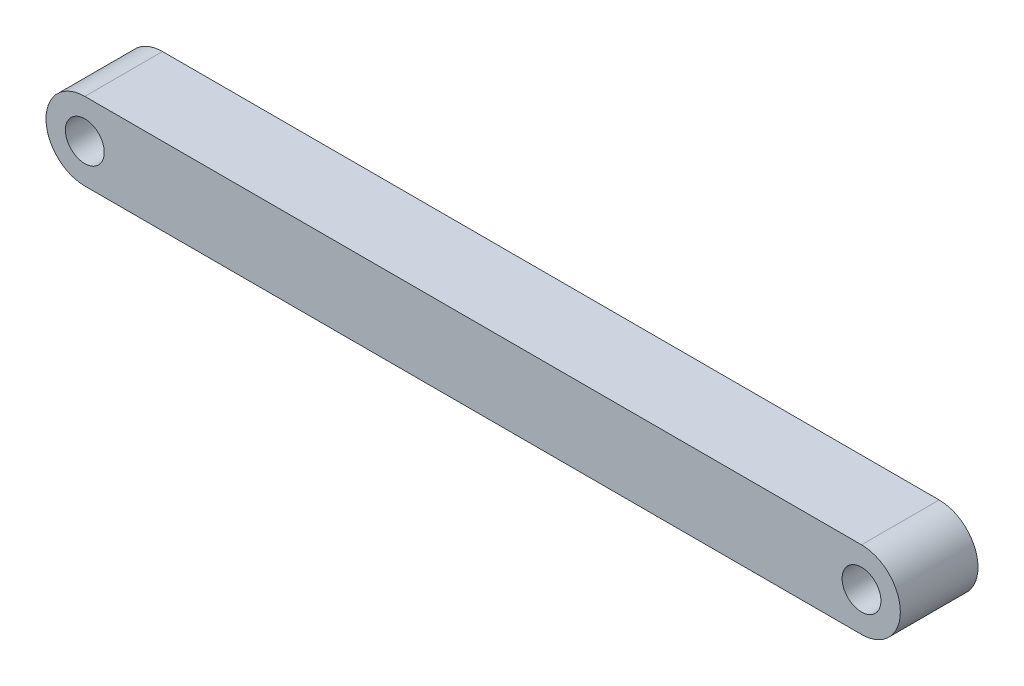
ISO-10303-21;
HEADER;
FILE_DESCRIPTION(('STEP AP214'),'2;1');
FILE_NAME('part.step','',(''),(''),'','','');
FILE_SCHEMA(('AUTOMOTIVE_DESIGN { 1 0 10303 214 1 1 1 1 }'));
ENDSEC;
DATA;
#1=APPLICATION_CONTEXT('core data for automotive mechanical design processes');
#2=APPLICATION_PROTOCOL_DEFINITION('international standard','automotive_design',2000,#1);
#3=PRODUCT_CONTEXT('',#1,'mechanical');
#4=PRODUCT('Part','Part','',(#3));
#5=PRODUCT_RELATED_PRODUCT_CATEGORY('part','',(#4));
#6=PRODUCT_DEFINITION_FORMATION('','',#4);
#7=PRODUCT_DEFINITION_CONTEXT('part definition',#1,'design');
#8=PRODUCT_DEFINITION('design','',#6,#7);
#9=PRODUCT_DEFINITION_SHAPE('','',#8);
#10=(LENGTH_UNIT() NAMED_UNIT(*) SI_UNIT(.MILLI.,.METRE.));
#11=(NAMED_UNIT(*) PLANE_ANGLE_UNIT() SI_UNIT($,.RADIAN.));
#12=(NAMED_UNIT(*) SI_UNIT($,.STERADIAN.) SOLID_ANGLE_UNIT());
#13=UNCERTAINTY_MEASURE_WITH_UNIT(LENGTH_MEASURE(1.E-05),#10,'distance_accuracy_value','');
#14=(GEOMETRIC_REPRESENTATION_CONTEXT(3) GLOBAL_UNCERTAINTY_ASSIGNED_CONTEXT((#13)) GLOBAL_UNIT_ASSIGNED_CONTEXT((#10,
#11,#12)) REPRESENTATION_CONTEXT('',''));
#15=CARTESIAN_POINT('',(0.,0.,0.));
#16=DIRECTION('',(0.,0.,1.));
#17=DIRECTION('',(1.,0.,0.));
#18=AXIS2_PLACEMENT_3D('',#15,#16,#17);
#19=CARTESIAN_POINT('',(-25.,0.,5.));
#20=DIRECTION('',(0.,0.,1.));
#21=DIRECTION('',(1.,0.,0.));
#22=AXIS2_PLACEMENT_3D('',#19,#20,#21);
#23=PLANE('',#22);
#24=CARTESIAN_POINT('',(25.,0.,5.));
#25=DIRECTION('',(0.,0.,1.));
#26=DIRECTION('',(1.,0.,0.));
#27=AXIS2_PLACEMENT_3D('',#24,#25,#26);
#28=CIRCLE('',#27,1.25);
#29=CARTESIAN_POINT('',(26.25,0.,5.));
#30=VERTEX_POINT('',#29);
#31=EDGE_CURVE('E141',#30,#30,#28,.T.);
#32=ORIENTED_EDGE('',*,*,#31,.F.);
#33=EDGE_LOOP('',(#32));
#34=FACE_BOUND('',#33,.T.);
#35=CARTESIAN_POINT('',(-25.,0.,5.));
#36=DIRECTION('',(0.,0.,1.));
#37=DIRECTION('',(1.,0.,0.));
#38=AXIS2_PLACEMENT_3D('',#35,#36,#37);
#39=CIRCLE('',#38,2.5);
#40=CARTESIAN_POINT('',(-25.,2.5,5.));
#41=VERTEX_POINT('',#40);
#42=CARTESIAN_POINT('',(-25.,-2.5,5.));
#43=VERTEX_POINT('',#42);
#44=EDGE_CURVE('E120',#41,#43,#39,.T.);
#45=ORIENTED_EDGE('',*,*,#44,.T.);
#46=DIRECTION('',(1.,0.,0.));
#47=VECTOR('',#46,1.);
#48=CARTESIAN_POINT('',(-25.,-2.5,5.));
#49=LINE('',#48,#47);
#50=CARTESIAN_POINT('',(25.,-2.49999999999999,5.));
#51=VERTEX_POINT('',#50);
#52=EDGE_CURVE('E113',#43,#51,#49,.T.);
#53=ORIENTED_EDGE('',*,*,#52,.T.);
#54=CARTESIAN_POINT('',(25.,0.,5.));
#55=DIRECTION('',(0.,0.,1.));
#56=DIRECTION('',(1.,0.,0.));
#57=AXIS2_PLACEMENT_3D('',#54,#55,#56);
#58=CIRCLE('',#57,2.5);
#59=CARTESIAN_POINT('',(25.,2.50000000000001,5.));
#60=VERTEX_POINT('',#59);
#61=EDGE_CURVE('E119',#51,#60,#58,.T.);
#62=ORIENTED_EDGE('',*,*,#61,.T.);
#63=DIRECTION('',(1.,0.,0.));
#64=VECTOR('',#63,1.);
#65=CARTESIAN_POINT('',(-25.,2.5,5.));
#66=LINE('',#65,#64);
#67=EDGE_CURVE('E132',#41,#60,#66,.T.);
#68=ORIENTED_EDGE('',*,*,#67,.F.);
#69=EDGE_LOOP('',(#45,#53,#62,#68));
#70=FACE_BOUND('',#69,.T.);
#71=CARTESIAN_POINT('',(-25.,0.,5.));
#72=DIRECTION('',(0.,0.,1.));
#73=DIRECTION('',(1.,0.,0.));
#74=AXIS2_PLACEMENT_3D('',#71,#72,#73);
#75=CIRCLE('',#74,1.25);
#76=CARTESIAN_POINT('',(-23.75,0.,5.));
#77=VERTEX_POINT('',#76);
#78=EDGE_CURVE('E161',#77,#77,#75,.T.);
#79=ORIENTED_EDGE('',*,*,#78,.F.);
#80=EDGE_LOOP('',(#79));
#81=FACE_BOUND('',#80,.T.);
#82=ADVANCED_FACE('F69',(#34,#70,#81),#23,.T.);
#83=CARTESIAN_POINT('',(-25.,0.,0.));
#84=DIRECTION('',(0.,0.,1.));
#85=DIRECTION('',(1.,0.,0.));
#86=AXIS2_PLACEMENT_3D('',#83,#84,#85);
#87=PLANE('',#86);
#88=CARTESIAN_POINT('',(-25.,0.,0.));
#89=DIRECTION('',(0.,0.,1.));
#90=DIRECTION('',(1.,0.,0.));
#91=AXIS2_PLACEMENT_3D('',#88,#89,#90);
#92=CIRCLE('',#91,2.5);
#93=CARTESIAN_POINT('',(-25.,2.5,0.));
#94=VERTEX_POINT('',#93);
#95=CARTESIAN_POINT('',(-25.,-2.5,0.));
#96=VERTEX_POINT('',#95);
#97=EDGE_CURVE('E138',#94,#96,#92,.T.);
#98=ORIENTED_EDGE('',*,*,#97,.F.);
#99=DIRECTION('',(1.,0.,0.));
#100=VECTOR('',#99,1.);
#101=CARTESIAN_POINT('',(-25.,2.5,0.));
#102=LINE('',#101,#100);
#103=CARTESIAN_POINT('',(25.,2.50000000000001,0.));
#104=VERTEX_POINT('',#103);
#105=EDGE_CURVE('E147',#94,#104,#102,.T.);
#106=ORIENTED_EDGE('',*,*,#105,.T.);
#107=CARTESIAN_POINT('',(25.,0.,0.));
#108=DIRECTION('',(0.,0.,1.));
#109=DIRECTION('',(1.,0.,0.));
#110=AXIS2_PLACEMENT_3D('',#107,#108,#109);
#111=CIRCLE('',#110,2.5);
#112=CARTESIAN_POINT('',(25.,-2.49999999999999,0.));
#113=VERTEX_POINT('',#112);
#114=EDGE_CURVE('E144',#113,#104,#111,.T.);
#115=ORIENTED_EDGE('',*,*,#114,.F.);
#116=DIRECTION('',(1.,0.,0.));
#117=VECTOR('',#116,1.);
#118=CARTESIAN_POINT('',(-25.,-2.5,0.));
#119=LINE('',#118,#117);
#120=EDGE_CURVE('E126',#96,#113,#119,.T.);
#121=ORIENTED_EDGE('',*,*,#120,.F.);
#122=EDGE_LOOP('',(#98,#106,#115,#121));
#123=FACE_BOUND('',#122,.T.);
#124=CARTESIAN_POINT('',(25.,0.,0.));
#125=DIRECTION('',(0.,0.,1.));
#126=DIRECTION('',(1.,0.,0.));
#127=AXIS2_PLACEMENT_3D('',#124,#125,#126);
#128=CIRCLE('',#127,1.25);
#129=CARTESIAN_POINT('',(26.25,0.,0.));
#130=VERTEX_POINT('',#129);
#131=EDGE_CURVE('E157',#130,#130,#128,.T.);
#132=ORIENTED_EDGE('',*,*,#131,.T.);
#133=EDGE_LOOP('',(#132));
#134=FACE_BOUND('',#133,.T.);
#135=CARTESIAN_POINT('',(-25.,0.,0.));
#136=DIRECTION('',(0.,0.,1.));
#137=DIRECTION('',(1.,0.,0.));
#138=AXIS2_PLACEMENT_3D('',#135,#136,#137);
#139=CIRCLE('',#138,1.25);
#140=CARTESIAN_POINT('',(-23.75,0.,0.));
#141=VERTEX_POINT('',#140);
#142=EDGE_CURVE('E165',#141,#141,#139,.T.);
#143=ORIENTED_EDGE('',*,*,#142,.T.);
#144=EDGE_LOOP('',(#143));
#145=FACE_BOUND('',#144,.T.);
#146=ADVANCED_FACE('F176',(#123,#134,#145),#87,.F.);
#147=CARTESIAN_POINT('',(-25.,0.,5.));
#148=DIRECTION('',(0.,0.,-1.));
#149=DIRECTION('',(-1.,0.,0.));
#150=AXIS2_PLACEMENT_3D('',#147,#148,#149);
#151=CYLINDRICAL_SURFACE('',#150,2.5);
#152=ORIENTED_EDGE('',*,*,#97,.T.);
#153=DIRECTION('',(0.,0.,-1.));
#154=VECTOR('',#153,1.);
#155=CARTESIAN_POINT('',(-25.,-2.5,5.));
#156=LINE('',#155,#154);
#157=EDGE_CURVE('E12',#43,#96,#156,.T.);
#158=ORIENTED_EDGE('',*,*,#157,.F.);
#159=ORIENTED_EDGE('',*,*,#44,.F.);
#160=DIRECTION('',(0.,0.,-1.));
#161=VECTOR('',#160,1.);
#162=CARTESIAN_POINT('',(-25.,2.5,5.));
#163=LINE('',#162,#161);
#164=EDGE_CURVE('E87',#41,#94,#163,.T.);
#165=ORIENTED_EDGE('',*,*,#164,.T.);
#166=EDGE_LOOP('',(#152,#158,#159,#165));
#167=FACE_BOUND('',#166,.T.);
#168=ADVANCED_FACE('F71',(#167),#151,.T.);
#169=CARTESIAN_POINT('',(-25.,-2.5,5.));
#170=DIRECTION('',(0.,1.,0.));
#171=DIRECTION('',(-1.,0.,0.));
#172=AXIS2_PLACEMENT_3D('',#169,#170,#171);
#173=PLANE('',#172);
#174=ORIENTED_EDGE('',*,*,#120,.T.);
#175=DIRECTION('',(0.,0.,-1.));
#176=VECTOR('',#175,1.);
#177=CARTESIAN_POINT('',(25.,-2.49999999999999,5.));
#178=LINE('',#177,#176);
#179=EDGE_CURVE('E79',#51,#113,#178,.T.);
#180=ORIENTED_EDGE('',*,*,#179,.F.);
#181=ORIENTED_EDGE('',*,*,#52,.F.);
#182=ORIENTED_EDGE('',*,*,#157,.T.);
#183=EDGE_LOOP('',(#174,#180,#181,#182));
#184=FACE_BOUND('',#183,.T.);
#185=ADVANCED_FACE('F125',(#184),#173,.F.);
#186=CARTESIAN_POINT('',(25.,0.,5.));
#187=DIRECTION('',(0.,0.,-1.));
#188=DIRECTION('',(-1.,0.,0.));
#189=AXIS2_PLACEMENT_3D('',#186,#187,#188);
#190=CYLINDRICAL_SURFACE('',#189,2.5);
#191=ORIENTED_EDGE('',*,*,#114,.T.);
#192=DIRECTION('',(0.,0.,-1.));
#193=VECTOR('',#192,1.);
#194=CARTESIAN_POINT('',(25.,2.50000000000001,5.));
#195=LINE('',#194,#193);
#196=EDGE_CURVE('E102',#60,#104,#195,.T.);
#197=ORIENTED_EDGE('',*,*,#196,.F.);
#198=ORIENTED_EDGE('',*,*,#61,.F.);
#199=ORIENTED_EDGE('',*,*,#179,.T.);
#200=EDGE_LOOP('',(#191,#197,#198,#199));
#201=FACE_BOUND('',#200,.T.);
#202=ADVANCED_FACE('F130',(#201),#190,.T.);
#203=CARTESIAN_POINT('',(-25.,2.5,5.));
#204=DIRECTION('',(0.,1.,0.));
#205=DIRECTION('',(-1.,0.,0.));
#206=AXIS2_PLACEMENT_3D('',#203,#204,#205);
#207=PLANE('',#206);
#208=ORIENTED_EDGE('',*,*,#105,.F.);
#209=ORIENTED_EDGE('',*,*,#164,.F.);
#210=ORIENTED_EDGE('',*,*,#67,.T.);
#211=ORIENTED_EDGE('',*,*,#196,.T.);
#212=EDGE_LOOP('',(#208,#209,#210,#211));
#213=FACE_BOUND('',#212,.T.);
#214=ADVANCED_FACE('F188',(#213),#207,.T.);
#215=CARTESIAN_POINT('',(25.,0.,5.));
#216=DIRECTION('',(0.,0.,-1.));
#217=DIRECTION('',(-1.,0.,0.));
#218=AXIS2_PLACEMENT_3D('',#215,#216,#217);
#219=CYLINDRICAL_SURFACE('',#218,1.25);
#220=ORIENTED_EDGE('',*,*,#31,.T.);
#221=EDGE_LOOP('',(#220));
#222=FACE_BOUND('',#221,.T.);
#223=ORIENTED_EDGE('',*,*,#131,.F.);
#224=EDGE_LOOP('',(#223));
#225=FACE_BOUND('',#224,.T.);
#226=ADVANCED_FACE('F185',(#222,#225),#219,.F.);
#227=CARTESIAN_POINT('',(-25.,0.,5.));
#228=DIRECTION('',(0.,0.,-1.));
#229=DIRECTION('',(-1.,0.,0.));
#230=AXIS2_PLACEMENT_3D('',#227,#228,#229);
#231=CYLINDRICAL_SURFACE('',#230,1.25);
#232=ORIENTED_EDGE('',*,*,#78,.T.);
#233=EDGE_LOOP('',(#232));
#234=FACE_BOUND('',#233,.T.);
#235=ORIENTED_EDGE('',*,*,#142,.F.);
#236=EDGE_LOOP('',(#235));
#237=FACE_BOUND('',#236,.T.);
#238=ADVANCED_FACE('F173',(#234,#237),#231,.F.);
#239=CLOSED_SHELL('',(#82,#146,#168,#185,#202,#214,#226,#238));
#240=MANIFOLD_SOLID_BREP('B2',#239);
#241=ADVANCED_BREP_SHAPE_REPRESENTATION('',(#18,#240),#14);
#242=SHAPE_DEFINITION_REPRESENTATION(#9,#241);
ENDSEC;
END-ISO-10303-21;
